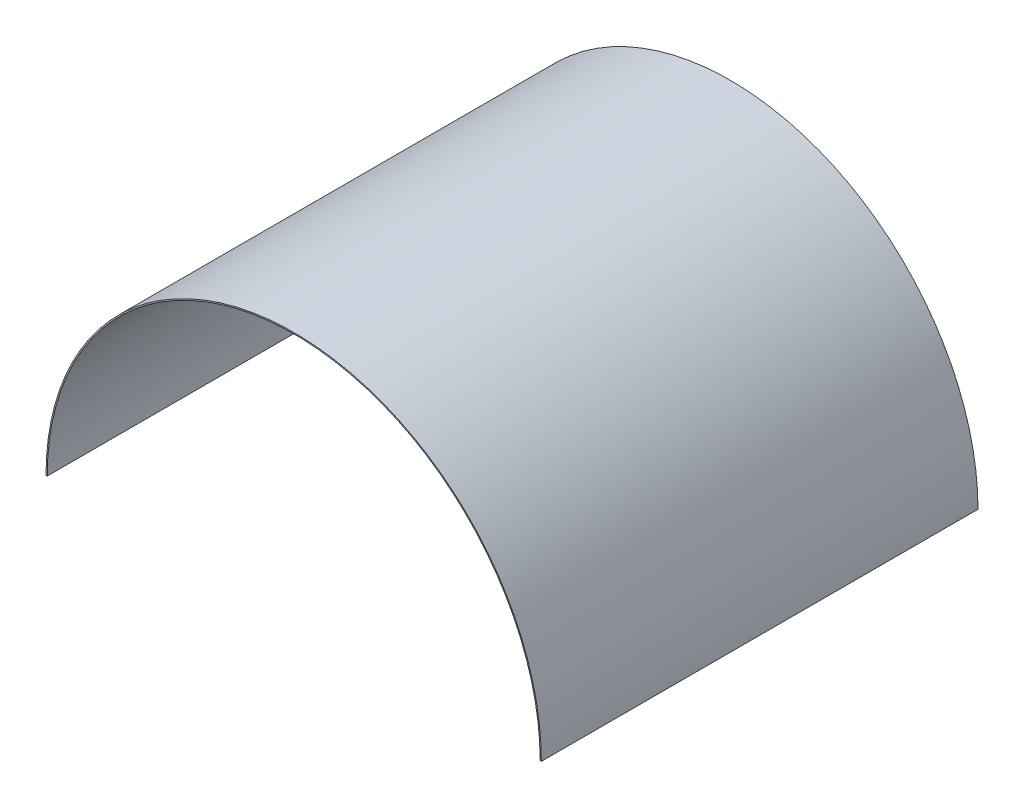
ISO-10303-21;
HEADER;
FILE_DESCRIPTION(('STEP AP214'),'2;1');
FILE_NAME('part.step','',(''),(''),'','','');
FILE_SCHEMA(('AUTOMOTIVE_DESIGN { 1 0 10303 214 1 1 1 1 }'));
ENDSEC;
DATA;
#1=APPLICATION_CONTEXT('core data for automotive mechanical design processes');
#2=APPLICATION_PROTOCOL_DEFINITION('international standard','automotive_design',2000,#1);
#3=PRODUCT_CONTEXT('',#1,'mechanical');
#4=PRODUCT('Part','Part','',(#3));
#5=PRODUCT_RELATED_PRODUCT_CATEGORY('part','',(#4));
#6=PRODUCT_DEFINITION_FORMATION('','',#4);
#7=PRODUCT_DEFINITION_CONTEXT('part definition',#1,'design');
#8=PRODUCT_DEFINITION('design','',#6,#7);
#9=PRODUCT_DEFINITION_SHAPE('','',#8);
#10=(LENGTH_UNIT() NAMED_UNIT(*) SI_UNIT(.MILLI.,.METRE.));
#11=(NAMED_UNIT(*) PLANE_ANGLE_UNIT() SI_UNIT($,.RADIAN.));
#12=(NAMED_UNIT(*) SI_UNIT($,.STERADIAN.) SOLID_ANGLE_UNIT());
#13=UNCERTAINTY_MEASURE_WITH_UNIT(LENGTH_MEASURE(1.E-05),#10,'distance_accuracy_value','');
#14=(GEOMETRIC_REPRESENTATION_CONTEXT(3) GLOBAL_UNCERTAINTY_ASSIGNED_CONTEXT((#13)) GLOBAL_UNIT_ASSIGNED_CONTEXT((#10,
#11,#12)) REPRESENTATION_CONTEXT('',''));
#15=CARTESIAN_POINT('',(0.,0.,0.));
#16=DIRECTION('',(0.,0.,1.));
#17=DIRECTION('',(1.,0.,0.));
#18=AXIS2_PLACEMENT_3D('',#15,#16,#17);
#19=CARTESIAN_POINT('',(0.,0.,360.));
#20=DIRECTION('',(0.,0.,-1.));
#21=DIRECTION('',(-1.,0.,0.));
#22=AXIS2_PLACEMENT_3D('',#19,#20,#21);
#23=CYLINDRICAL_SURFACE('',#22,204.2);
#24=CARTESIAN_POINT('',(0.,0.,0.));
#25=DIRECTION('',(0.,0.,1.));
#26=DIRECTION('',(1.,0.,0.));
#27=AXIS2_PLACEMENT_3D('',#24,#25,#26);
#28=CIRCLE('',#27,204.2);
#29=CARTESIAN_POINT('',(204.2,0.,0.));
#30=VERTEX_POINT('',#29);
#31=CARTESIAN_POINT('',(-204.2,0.,0.));
#32=VERTEX_POINT('',#31);
#33=EDGE_CURVE('E105',#30,#32,#28,.T.);
#34=ORIENTED_EDGE('',*,*,#33,.T.);
#35=DIRECTION('',(0.,0.,-1.));
#36=VECTOR('',#35,1.);
#37=CARTESIAN_POINT('',(-204.2,0.,360.));
#38=LINE('',#37,#36);
#39=CARTESIAN_POINT('',(-204.2,0.,360.));
#40=VERTEX_POINT('',#39);
#41=EDGE_CURVE('E11',#40,#32,#38,.T.);
#42=ORIENTED_EDGE('',*,*,#41,.F.);
#43=CARTESIAN_POINT('',(0.,0.,360.));
#44=DIRECTION('',(0.,0.,1.));
#45=DIRECTION('',(1.,0.,0.));
#46=AXIS2_PLACEMENT_3D('',#43,#44,#45);
#47=CIRCLE('',#46,204.2);
#48=CARTESIAN_POINT('',(204.2,0.,360.));
#49=VERTEX_POINT('',#48);
#50=EDGE_CURVE('E80',#49,#40,#47,.T.);
#51=ORIENTED_EDGE('',*,*,#50,.F.);
#52=DIRECTION('',(0.,0.,-1.));
#53=VECTOR('',#52,1.);
#54=CARTESIAN_POINT('',(204.2,0.,360.));
#55=LINE('',#54,#53);
#56=EDGE_CURVE('E54',#49,#30,#55,.T.);
#57=ORIENTED_EDGE('',*,*,#56,.T.);
#58=EDGE_LOOP('',(#34,#42,#51,#57));
#59=FACE_BOUND('',#58,.T.);
#60=ADVANCED_FACE('F39',(#59),#23,.T.);
#61=CARTESIAN_POINT('',(-203.2,0.,360.));
#62=DIRECTION('',(0.,-1.,0.));
#63=DIRECTION('',(1.,0.,0.));
#64=AXIS2_PLACEMENT_3D('',#61,#62,#63);
#65=PLANE('',#64);
#66=DIRECTION('',(-1.,0.,0.));
#67=VECTOR('',#66,1.);
#68=CARTESIAN_POINT('',(-203.2,0.,0.));
#69=LINE('',#68,#67);
#70=CARTESIAN_POINT('',(-203.2,0.,0.));
#71=VERTEX_POINT('',#70);
#72=EDGE_CURVE('E88',#71,#32,#69,.T.);
#73=ORIENTED_EDGE('',*,*,#72,.F.);
#74=DIRECTION('',(0.,0.,-1.));
#75=VECTOR('',#74,1.);
#76=CARTESIAN_POINT('',(-203.2,0.,360.));
#77=LINE('',#76,#75);
#78=CARTESIAN_POINT('',(-203.2,0.,360.));
#79=VERTEX_POINT('',#78);
#80=EDGE_CURVE('E50',#79,#71,#77,.T.);
#81=ORIENTED_EDGE('',*,*,#80,.F.);
#82=DIRECTION('',(-1.,0.,0.));
#83=VECTOR('',#82,1.);
#84=CARTESIAN_POINT('',(-203.2,0.,360.));
#85=LINE('',#84,#83);
#86=EDGE_CURVE('E86',#79,#40,#85,.T.);
#87=ORIENTED_EDGE('',*,*,#86,.T.);
#88=ORIENTED_EDGE('',*,*,#41,.T.);
#89=EDGE_LOOP('',(#73,#81,#87,#88));
#90=FACE_BOUND('',#89,.T.);
#91=ADVANCED_FACE('F82',(#90),#65,.T.);
#92=CARTESIAN_POINT('',(0.,0.,360.));
#93=DIRECTION('',(0.,0.,-1.));
#94=DIRECTION('',(-1.,0.,0.));
#95=AXIS2_PLACEMENT_3D('',#92,#93,#94);
#96=CYLINDRICAL_SURFACE('',#95,203.2);
#97=CARTESIAN_POINT('',(0.,0.,0.));
#98=DIRECTION('',(0.,0.,1.));
#99=DIRECTION('',(1.,0.,0.));
#100=AXIS2_PLACEMENT_3D('',#97,#98,#99);
#101=CIRCLE('',#100,203.2);
#102=CARTESIAN_POINT('',(203.2,0.,0.));
#103=VERTEX_POINT('',#102);
#104=EDGE_CURVE('E103',#103,#71,#101,.T.);
#105=ORIENTED_EDGE('',*,*,#104,.F.);
#106=DIRECTION('',(0.,0.,-1.));
#107=VECTOR('',#106,1.);
#108=CARTESIAN_POINT('',(203.2,0.,360.));
#109=LINE('',#108,#107);
#110=CARTESIAN_POINT('',(203.2,0.,360.));
#111=VERTEX_POINT('',#110);
#112=EDGE_CURVE('E66',#111,#103,#109,.T.);
#113=ORIENTED_EDGE('',*,*,#112,.F.);
#114=CARTESIAN_POINT('',(0.,0.,360.));
#115=DIRECTION('',(0.,0.,1.));
#116=DIRECTION('',(1.,0.,0.));
#117=AXIS2_PLACEMENT_3D('',#114,#115,#116);
#118=CIRCLE('',#117,203.2);
#119=EDGE_CURVE('E92',#111,#79,#118,.T.);
#120=ORIENTED_EDGE('',*,*,#119,.T.);
#121=ORIENTED_EDGE('',*,*,#80,.T.);
#122=EDGE_LOOP('',(#105,#113,#120,#121));
#123=FACE_BOUND('',#122,.T.);
#124=ADVANCED_FACE('F96',(#123),#96,.F.);
#125=CARTESIAN_POINT('',(204.2,0.,360.));
#126=DIRECTION('',(0.,-1.,0.));
#127=DIRECTION('',(0.,0.,-1.));
#128=AXIS2_PLACEMENT_3D('',#125,#126,#127);
#129=PLANE('',#128);
#130=DIRECTION('',(-1.,0.,0.));
#131=VECTOR('',#130,1.);
#132=CARTESIAN_POINT('',(204.2,0.,0.));
#133=LINE('',#132,#131);
#134=EDGE_CURVE('E107',#30,#103,#133,.T.);
#135=ORIENTED_EDGE('',*,*,#134,.F.);
#136=ORIENTED_EDGE('',*,*,#56,.F.);
#137=DIRECTION('',(-1.,0.,0.));
#138=VECTOR('',#137,1.);
#139=CARTESIAN_POINT('',(204.2,0.,360.));
#140=LINE('',#139,#138);
#141=EDGE_CURVE('E100',#49,#111,#140,.T.);
#142=ORIENTED_EDGE('',*,*,#141,.T.);
#143=ORIENTED_EDGE('',*,*,#112,.T.);
#144=EDGE_LOOP('',(#135,#136,#142,#143));
#145=FACE_BOUND('',#144,.T.);
#146=ADVANCED_FACE('F111',(#145),#129,.T.);
#147=CARTESIAN_POINT('',(0.,0.,360.));
#148=DIRECTION('',(0.,0.,1.));
#149=DIRECTION('',(1.,0.,0.));
#150=AXIS2_PLACEMENT_3D('',#147,#148,#149);
#151=PLANE('',#150);
#152=ORIENTED_EDGE('',*,*,#50,.T.);
#153=ORIENTED_EDGE('',*,*,#86,.F.);
#154=ORIENTED_EDGE('',*,*,#119,.F.);
#155=ORIENTED_EDGE('',*,*,#141,.F.);
#156=EDGE_LOOP('',(#152,#153,#154,#155));
#157=FACE_BOUND('',#156,.T.);
#158=ADVANCED_FACE('F93',(#157),#151,.T.);
#159=CARTESIAN_POINT('',(0.,0.,0.));
#160=DIRECTION('',(0.,0.,1.));
#161=DIRECTION('',(1.,0.,0.));
#162=AXIS2_PLACEMENT_3D('',#159,#160,#161);
#163=PLANE('',#162);
#164=ORIENTED_EDGE('',*,*,#33,.F.);
#165=ORIENTED_EDGE('',*,*,#134,.T.);
#166=ORIENTED_EDGE('',*,*,#104,.T.);
#167=ORIENTED_EDGE('',*,*,#72,.T.);
#168=EDGE_LOOP('',(#164,#165,#166,#167));
#169=FACE_BOUND('',#168,.T.);
#170=ADVANCED_FACE('F115',(#169),#163,.F.);
#171=CLOSED_SHELL('',(#60,#91,#124,#146,#158,#170));
#172=MANIFOLD_SOLID_BREP('B2',#171);
#173=ADVANCED_BREP_SHAPE_REPRESENTATION('',(#18,#172),#14);
#174=SHAPE_DEFINITION_REPRESENTATION(#9,#173);
ENDSEC;
END-ISO-10303-21;
